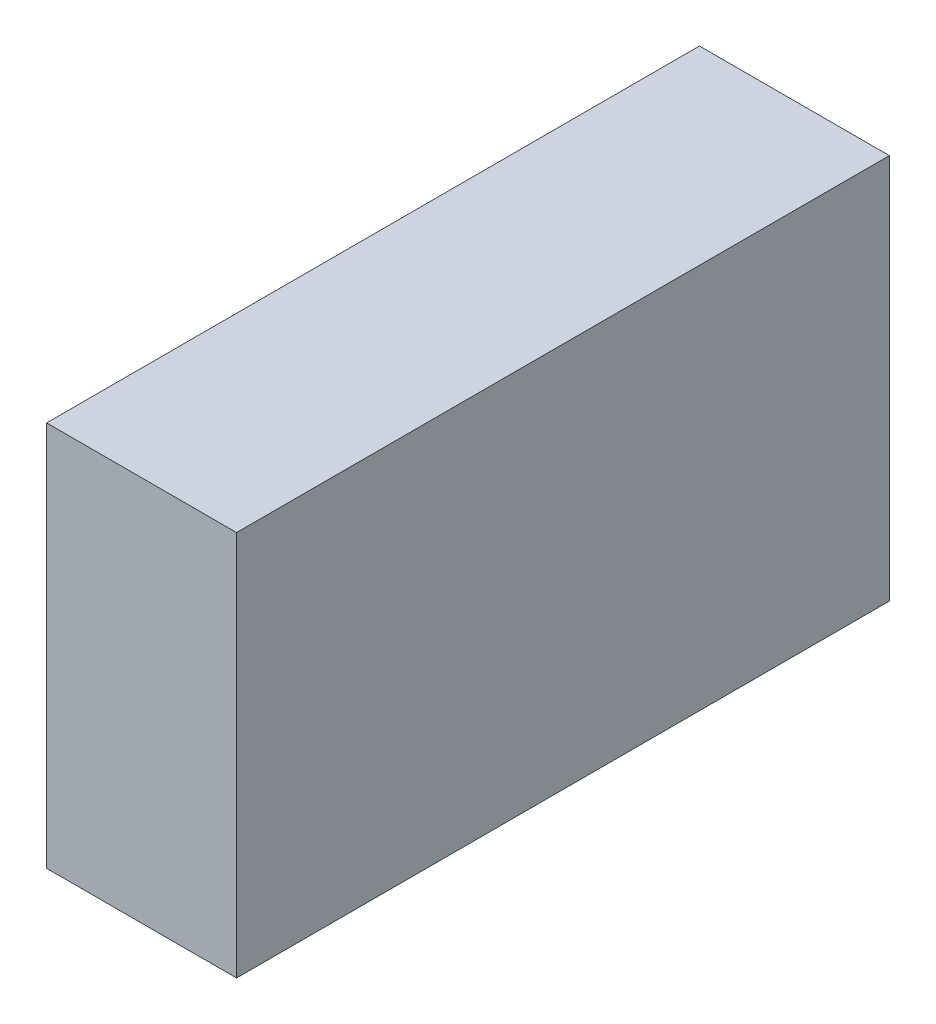
ISO-10303-21;
HEADER;
FILE_DESCRIPTION(('STEP AP214'),'2;1');
FILE_NAME('part.step','',(''),(''),'','','');
FILE_SCHEMA(('AUTOMOTIVE_DESIGN { 1 0 10303 214 1 1 1 1 }'));
ENDSEC;
DATA;
#1=APPLICATION_CONTEXT('core data for automotive mechanical design processes');
#2=APPLICATION_PROTOCOL_DEFINITION('international standard','automotive_design',2000,#1);
#3=PRODUCT_CONTEXT('',#1,'mechanical');
#4=PRODUCT('Part','Part','',(#3));
#5=PRODUCT_RELATED_PRODUCT_CATEGORY('part','',(#4));
#6=PRODUCT_DEFINITION_FORMATION('','',#4);
#7=PRODUCT_DEFINITION_CONTEXT('part definition',#1,'design');
#8=PRODUCT_DEFINITION('design','',#6,#7);
#9=PRODUCT_DEFINITION_SHAPE('','',#8);
#10=(LENGTH_UNIT() NAMED_UNIT(*) SI_UNIT(.MILLI.,.METRE.));
#11=(NAMED_UNIT(*) PLANE_ANGLE_UNIT() SI_UNIT($,.RADIAN.));
#12=(NAMED_UNIT(*) SI_UNIT($,.STERADIAN.) SOLID_ANGLE_UNIT());
#13=UNCERTAINTY_MEASURE_WITH_UNIT(LENGTH_MEASURE(1.E-05),#10,'distance_accuracy_value','');
#14=(GEOMETRIC_REPRESENTATION_CONTEXT(3) GLOBAL_UNCERTAINTY_ASSIGNED_CONTEXT((#13)) GLOBAL_UNIT_ASSIGNED_CONTEXT((#10,
#11,#12)) REPRESENTATION_CONTEXT('',''));
#15=CARTESIAN_POINT('',(0.,0.,0.));
#16=DIRECTION('',(0.,0.,1.));
#17=DIRECTION('',(1.,0.,0.));
#18=AXIS2_PLACEMENT_3D('',#15,#16,#17);
#19=CARTESIAN_POINT('',(-16.,32.5,110.));
#20=DIRECTION('',(1.,0.,0.));
#21=DIRECTION('',(0.,0.,-1.));
#22=AXIS2_PLACEMENT_3D('',#19,#20,#21);
#23=PLANE('',#22);
#24=DIRECTION('',(0.,-1.,0.));
#25=VECTOR('',#24,1.);
#26=CARTESIAN_POINT('',(-16.,32.5,0.));
#27=LINE('',#26,#25);
#28=CARTESIAN_POINT('',(-16.,32.5,0.));
#29=VERTEX_POINT('',#28);
#30=CARTESIAN_POINT('',(-16.,-32.5,0.));
#31=VERTEX_POINT('',#30);
#32=EDGE_CURVE('E96',#29,#31,#27,.T.);
#33=ORIENTED_EDGE('',*,*,#32,.T.);
#34=DIRECTION('',(0.,0.,-1.));
#35=VECTOR('',#34,1.);
#36=CARTESIAN_POINT('',(-16.,-32.5,110.));
#37=LINE('',#36,#35);
#38=CARTESIAN_POINT('',(-16.,-32.5,110.));
#39=VERTEX_POINT('',#38);
#40=EDGE_CURVE('E11',#39,#31,#37,.T.);
#41=ORIENTED_EDGE('',*,*,#40,.F.);
#42=DIRECTION('',(0.,-1.,0.));
#43=VECTOR('',#42,1.);
#44=CARTESIAN_POINT('',(-16.,32.5,110.));
#45=LINE('',#44,#43);
#46=CARTESIAN_POINT('',(-16.,32.5,110.));
#47=VERTEX_POINT('',#46);
#48=EDGE_CURVE('E84',#47,#39,#45,.T.);
#49=ORIENTED_EDGE('',*,*,#48,.F.);
#50=DIRECTION('',(0.,0.,-1.));
#51=VECTOR('',#50,1.);
#52=CARTESIAN_POINT('',(-16.,32.5,110.));
#53=LINE('',#52,#51);
#54=EDGE_CURVE('E92',#47,#29,#53,.T.);
#55=ORIENTED_EDGE('',*,*,#54,.T.);
#56=EDGE_LOOP('',(#33,#41,#49,#55));
#57=FACE_BOUND('',#56,.T.);
#58=ADVANCED_FACE('F33',(#57),#23,.F.);
#59=CARTESIAN_POINT('',(-16.,-32.5,110.));
#60=DIRECTION('',(0.,1.,0.));
#61=DIRECTION('',(0.,0.,1.));
#62=AXIS2_PLACEMENT_3D('',#59,#60,#61);
#63=PLANE('',#62);
#64=DIRECTION('',(1.,0.,0.));
#65=VECTOR('',#64,1.);
#66=CARTESIAN_POINT('',(-16.,-32.5,0.));
#67=LINE('',#66,#65);
#68=CARTESIAN_POINT('',(16.,-32.5,0.));
#69=VERTEX_POINT('',#68);
#70=EDGE_CURVE('E88',#31,#69,#67,.T.);
#71=ORIENTED_EDGE('',*,*,#70,.T.);
#72=DIRECTION('',(0.,0.,-1.));
#73=VECTOR('',#72,1.);
#74=CARTESIAN_POINT('',(16.,-32.5,110.));
#75=LINE('',#74,#73);
#76=CARTESIAN_POINT('',(16.,-32.5,110.));
#77=VERTEX_POINT('',#76);
#78=EDGE_CURVE('E41',#77,#69,#75,.T.);
#79=ORIENTED_EDGE('',*,*,#78,.F.);
#80=DIRECTION('',(1.,0.,0.));
#81=VECTOR('',#80,1.);
#82=CARTESIAN_POINT('',(-16.,-32.5,110.));
#83=LINE('',#82,#81);
#84=EDGE_CURVE('E79',#39,#77,#83,.T.);
#85=ORIENTED_EDGE('',*,*,#84,.F.);
#86=ORIENTED_EDGE('',*,*,#40,.T.);
#87=EDGE_LOOP('',(#71,#79,#85,#86));
#88=FACE_BOUND('',#87,.T.);
#89=ADVANCED_FACE('F87',(#88),#63,.F.);
#90=CARTESIAN_POINT('',(16.,-32.5,110.));
#91=DIRECTION('',(-1.,0.,0.));
#92=DIRECTION('',(0.,0.,1.));
#93=AXIS2_PLACEMENT_3D('',#90,#91,#92);
#94=PLANE('',#93);
#95=DIRECTION('',(0.,1.,0.));
#96=VECTOR('',#95,1.);
#97=CARTESIAN_POINT('',(16.,-32.5,0.));
#98=LINE('',#97,#96);
#99=CARTESIAN_POINT('',(16.,32.5,0.));
#100=VERTEX_POINT('',#99);
#101=EDGE_CURVE('E66',#69,#100,#98,.T.);
#102=ORIENTED_EDGE('',*,*,#101,.T.);
#103=DIRECTION('',(0.,0.,-1.));
#104=VECTOR('',#103,1.);
#105=CARTESIAN_POINT('',(16.,32.5,110.));
#106=LINE('',#105,#104);
#107=CARTESIAN_POINT('',(16.,32.5,110.));
#108=VERTEX_POINT('',#107);
#109=EDGE_CURVE('E89',#108,#100,#106,.T.);
#110=ORIENTED_EDGE('',*,*,#109,.F.);
#111=DIRECTION('',(0.,1.,0.));
#112=VECTOR('',#111,1.);
#113=CARTESIAN_POINT('',(16.,-32.5,110.));
#114=LINE('',#113,#112);
#115=EDGE_CURVE('E82',#77,#108,#114,.T.);
#116=ORIENTED_EDGE('',*,*,#115,.F.);
#117=ORIENTED_EDGE('',*,*,#78,.T.);
#118=EDGE_LOOP('',(#102,#110,#116,#117));
#119=FACE_BOUND('',#118,.T.);
#120=ADVANCED_FACE('F90',(#119),#94,.F.);
#121=CARTESIAN_POINT('',(16.,32.5,110.));
#122=DIRECTION('',(0.,-1.,0.));
#123=DIRECTION('',(0.,0.,-1.));
#124=AXIS2_PLACEMENT_3D('',#121,#122,#123);
#125=PLANE('',#124);
#126=DIRECTION('',(-1.,0.,0.));
#127=VECTOR('',#126,1.);
#128=CARTESIAN_POINT('',(16.,32.5,0.));
#129=LINE('',#128,#127);
#130=EDGE_CURVE('E72',#100,#29,#129,.T.);
#131=ORIENTED_EDGE('',*,*,#130,.T.);
#132=ORIENTED_EDGE('',*,*,#54,.F.);
#133=DIRECTION('',(-1.,0.,0.));
#134=VECTOR('',#133,1.);
#135=CARTESIAN_POINT('',(16.,32.5,110.));
#136=LINE('',#135,#134);
#137=EDGE_CURVE('E49',#108,#47,#136,.T.);
#138=ORIENTED_EDGE('',*,*,#137,.F.);
#139=ORIENTED_EDGE('',*,*,#109,.T.);
#140=EDGE_LOOP('',(#131,#132,#138,#139));
#141=FACE_BOUND('',#140,.T.);
#142=ADVANCED_FACE('F103',(#141),#125,.F.);
#143=CARTESIAN_POINT('',(0.,0.,110.));
#144=DIRECTION('',(0.,0.,1.));
#145=DIRECTION('',(1.,0.,0.));
#146=AXIS2_PLACEMENT_3D('',#143,#144,#145);
#147=PLANE('',#146);
#148=ORIENTED_EDGE('',*,*,#48,.T.);
#149=ORIENTED_EDGE('',*,*,#84,.T.);
#150=ORIENTED_EDGE('',*,*,#115,.T.);
#151=ORIENTED_EDGE('',*,*,#137,.T.);
#152=EDGE_LOOP('',(#148,#149,#150,#151));
#153=FACE_BOUND('',#152,.T.);
#154=ADVANCED_FACE('F80',(#153),#147,.T.);
#155=CARTESIAN_POINT('',(0.,0.,0.));
#156=DIRECTION('',(0.,0.,1.));
#157=DIRECTION('',(1.,0.,0.));
#158=AXIS2_PLACEMENT_3D('',#155,#156,#157);
#159=PLANE('',#158);
#160=ORIENTED_EDGE('',*,*,#32,.F.);
#161=ORIENTED_EDGE('',*,*,#130,.F.);
#162=ORIENTED_EDGE('',*,*,#101,.F.);
#163=ORIENTED_EDGE('',*,*,#70,.F.);
#164=EDGE_LOOP('',(#160,#161,#162,#163));
#165=FACE_BOUND('',#164,.T.);
#166=ADVANCED_FACE('F106',(#165),#159,.F.);
#167=CLOSED_SHELL('',(#58,#89,#120,#142,#154,#166));
#168=MANIFOLD_SOLID_BREP('B2',#167);
#169=ADVANCED_BREP_SHAPE_REPRESENTATION('',(#18,#168),#14);
#170=SHAPE_DEFINITION_REPRESENTATION(#9,#169);
ENDSEC;
END-ISO-10303-21;
